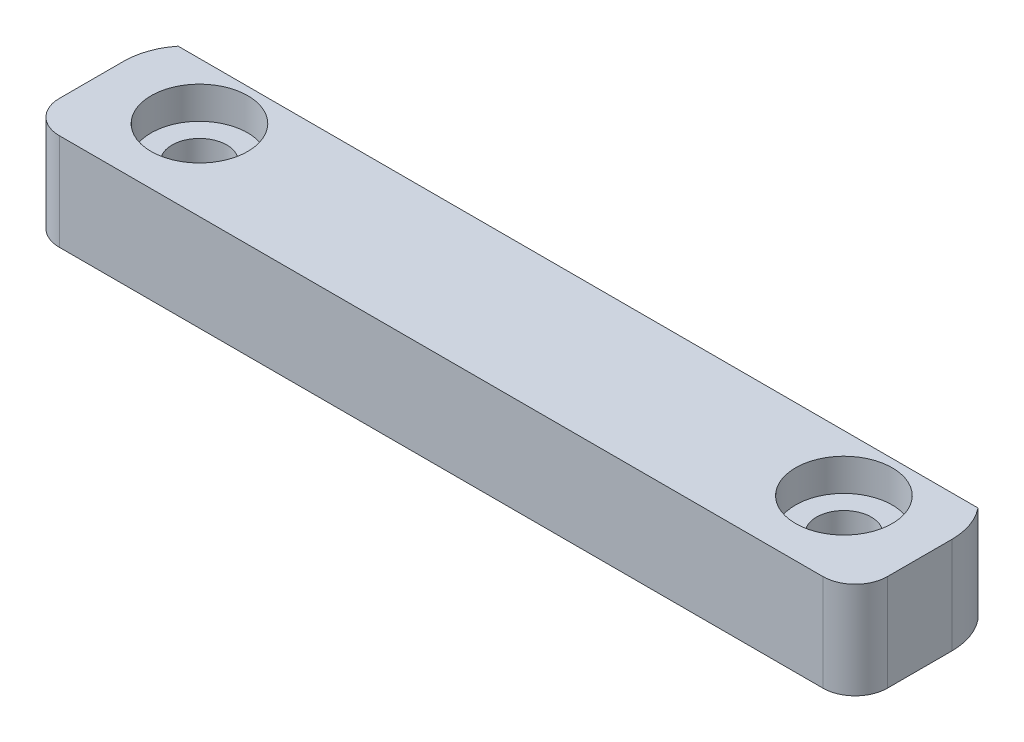
ISO-10303-21;
HEADER;
FILE_DESCRIPTION(('STEP AP214'),'2;1');
FILE_NAME('part.step','',(''),(''),'','','');
FILE_SCHEMA(('AUTOMOTIVE_DESIGN { 1 0 10303 214 1 1 1 1 }'));
ENDSEC;
DATA;
#1=APPLICATION_CONTEXT('core data for automotive mechanical design processes');
#2=APPLICATION_PROTOCOL_DEFINITION('international standard','automotive_design',2000,#1);
#3=PRODUCT_CONTEXT('',#1,'mechanical');
#4=PRODUCT('Part','Part','',(#3));
#5=PRODUCT_RELATED_PRODUCT_CATEGORY('part','',(#4));
#6=PRODUCT_DEFINITION_FORMATION('','',#4);
#7=PRODUCT_DEFINITION_CONTEXT('part definition',#1,'design');
#8=PRODUCT_DEFINITION('design','',#6,#7);
#9=PRODUCT_DEFINITION_SHAPE('','',#8);
#10=(LENGTH_UNIT() NAMED_UNIT(*) SI_UNIT(.MILLI.,.METRE.));
#11=(NAMED_UNIT(*) PLANE_ANGLE_UNIT() SI_UNIT($,.RADIAN.));
#12=(NAMED_UNIT(*) SI_UNIT($,.STERADIAN.) SOLID_ANGLE_UNIT());
#13=UNCERTAINTY_MEASURE_WITH_UNIT(LENGTH_MEASURE(1.E-05),#10,'distance_accuracy_value','');
#14=(GEOMETRIC_REPRESENTATION_CONTEXT(3) GLOBAL_UNCERTAINTY_ASSIGNED_CONTEXT((#13)) GLOBAL_UNIT_ASSIGNED_CONTEXT((#10,
#11,#12)) REPRESENTATION_CONTEXT('',''));
#15=CARTESIAN_POINT('',(0.,0.,0.));
#16=DIRECTION('',(0.,0.,1.));
#17=DIRECTION('',(1.,0.,0.));
#18=AXIS2_PLACEMENT_3D('',#15,#16,#17);
#19=CARTESIAN_POINT('',(20.,6.,0.));
#20=DIRECTION('',(0.,-1.,0.));
#21=DIRECTION('',(0.,0.,-1.));
#22=AXIS2_PLACEMENT_3D('',#19,#20,#21);
#23=CYLINDRICAL_SURFACE('',#22,1.7);
#24=CARTESIAN_POINT('',(20.,4.,0.));
#25=DIRECTION('',(0.,1.,0.));
#26=DIRECTION('',(0.,0.,1.));
#27=AXIS2_PLACEMENT_3D('',#24,#25,#26);
#28=CIRCLE('',#27,1.7);
#29=CARTESIAN_POINT('',(20.,4.,-1.7));
#30=VERTEX_POINT('',#29);
#31=EDGE_CURVE('E52',#30,#30,#28,.F.);
#32=ORIENTED_EDGE('',*,*,#31,.F.);
#33=DIRECTION('',(0.,1.,0.));
#34=VECTOR('',#33,1.);
#35=CARTESIAN_POINT('',(20.,0.,-1.7));
#36=LINE('',#35,#34);
#37=CARTESIAN_POINT('',(20.,0.,-1.7));
#38=VERTEX_POINT('',#37);
#39=EDGE_CURVE('E209',#38,#30,#36,.T.);
#40=ORIENTED_EDGE('',*,*,#39,.F.);
#41=CARTESIAN_POINT('',(20.,0.,0.));
#42=DIRECTION('',(0.,-1.,0.));
#43=DIRECTION('',(0.,0.,1.));
#44=AXIS2_PLACEMENT_3D('',#41,#42,#43);
#45=CIRCLE('',#44,1.7);
#46=CARTESIAN_POINT('',(20.,0.,1.7));
#47=VERTEX_POINT('',#46);
#48=EDGE_CURVE('E202',#38,#47,#45,.T.);
#49=ORIENTED_EDGE('',*,*,#48,.T.);
#50=CARTESIAN_POINT('',(20.,0.,0.));
#51=DIRECTION('',(0.,-1.,0.));
#52=DIRECTION('',(0.,0.,1.));
#53=AXIS2_PLACEMENT_3D('',#50,#51,#52);
#54=CIRCLE('',#53,1.7);
#55=EDGE_CURVE('E197',#47,#38,#54,.T.);
#56=ORIENTED_EDGE('',*,*,#55,.T.);
#57=ORIENTED_EDGE('',*,*,#39,.T.);
#58=EDGE_LOOP('',(#32,#40,#49,#56,#57));
#59=FACE_BOUND('',#58,.T.);
#60=ADVANCED_FACE('F48',(#59),#23,.F.);
#61=CARTESIAN_POINT('',(-20.,6.,0.));
#62=DIRECTION('',(0.,-1.,0.));
#63=DIRECTION('',(0.,0.,-1.));
#64=AXIS2_PLACEMENT_3D('',#61,#62,#63);
#65=CYLINDRICAL_SURFACE('',#64,1.7);
#66=CARTESIAN_POINT('',(-20.,4.,0.));
#67=DIRECTION('',(0.,1.,0.));
#68=DIRECTION('',(0.,0.,1.));
#69=AXIS2_PLACEMENT_3D('',#66,#67,#68);
#70=CIRCLE('',#69,1.7);
#71=CARTESIAN_POINT('',(-20.,4.,-1.7));
#72=VERTEX_POINT('',#71);
#73=EDGE_CURVE('E68',#72,#72,#70,.F.);
#74=ORIENTED_EDGE('',*,*,#73,.F.);
#75=DIRECTION('',(0.,1.,0.));
#76=VECTOR('',#75,1.);
#77=CARTESIAN_POINT('',(-20.,0.,-1.7));
#78=LINE('',#77,#76);
#79=CARTESIAN_POINT('',(-20.,0.,-1.7));
#80=VERTEX_POINT('',#79);
#81=EDGE_CURVE('E189',#80,#72,#78,.T.);
#82=ORIENTED_EDGE('',*,*,#81,.F.);
#83=CARTESIAN_POINT('',(-20.,0.,0.));
#84=DIRECTION('',(0.,1.,0.));
#85=DIRECTION('',(0.,0.,1.));
#86=AXIS2_PLACEMENT_3D('',#83,#84,#85);
#87=CIRCLE('',#86,1.7);
#88=CARTESIAN_POINT('',(-20.,0.,1.7));
#89=VERTEX_POINT('',#88);
#90=EDGE_CURVE('E201',#89,#80,#87,.T.);
#91=ORIENTED_EDGE('',*,*,#90,.F.);
#92=CARTESIAN_POINT('',(-20.,0.,0.));
#93=DIRECTION('',(0.,1.,0.));
#94=DIRECTION('',(0.,0.,1.));
#95=AXIS2_PLACEMENT_3D('',#92,#93,#94);
#96=CIRCLE('',#95,1.7);
#97=EDGE_CURVE('E218',#80,#89,#96,.T.);
#98=ORIENTED_EDGE('',*,*,#97,.F.);
#99=ORIENTED_EDGE('',*,*,#81,.T.);
#100=EDGE_LOOP('',(#74,#82,#91,#98,#99));
#101=FACE_BOUND('',#100,.T.);
#102=ADVANCED_FACE('F381',(#101),#65,.F.);
#103=CARTESIAN_POINT('',(-23.7,6.,3.));
#104=DIRECTION('',(0.,1.,0.));
#105=DIRECTION('',(0.,0.,1.));
#106=AXIS2_PLACEMENT_3D('',#103,#104,#105);
#107=CYLINDRICAL_SURFACE('',#106,2.);
#108=CARTESIAN_POINT('',(-23.7,6.,3.));
#109=DIRECTION('',(0.,1.,0.));
#110=DIRECTION('',(0.,0.,1.));
#111=AXIS2_PLACEMENT_3D('',#108,#109,#110);
#112=CIRCLE('',#111,2.);
#113=CARTESIAN_POINT('',(-25.7,6.,3.));
#114=VERTEX_POINT('',#113);
#115=CARTESIAN_POINT('',(-23.7,6.,5.));
#116=VERTEX_POINT('',#115);
#117=EDGE_CURVE('E179',#114,#116,#112,.T.);
#118=ORIENTED_EDGE('',*,*,#117,.F.);
#119=DIRECTION('',(0.,1.,0.));
#120=VECTOR('',#119,1.);
#121=CARTESIAN_POINT('',(-25.7,0.,3.));
#122=LINE('',#121,#120);
#123=CARTESIAN_POINT('',(-25.7,0.,3.));
#124=VERTEX_POINT('',#123);
#125=EDGE_CURVE('E206',#124,#114,#122,.T.);
#126=ORIENTED_EDGE('',*,*,#125,.F.);
#127=CARTESIAN_POINT('',(-23.7,0.,3.));
#128=DIRECTION('',(0.,-1.,0.));
#129=DIRECTION('',(0.,0.,1.));
#130=AXIS2_PLACEMENT_3D('',#127,#128,#129);
#131=CIRCLE('',#130,2.);
#132=CARTESIAN_POINT('',(-23.7,0.,5.));
#133=VERTEX_POINT('',#132);
#134=EDGE_CURVE('E236',#133,#124,#131,.T.);
#135=ORIENTED_EDGE('',*,*,#134,.F.);
#136=DIRECTION('',(0.,-1.,0.));
#137=VECTOR('',#136,1.);
#138=CARTESIAN_POINT('',(-23.7,6.,5.));
#139=LINE('',#138,#137);
#140=EDGE_CURVE('E207',#116,#133,#139,.T.);
#141=ORIENTED_EDGE('',*,*,#140,.F.);
#142=EDGE_LOOP('',(#118,#126,#135,#141));
#143=FACE_BOUND('',#142,.T.);
#144=ADVANCED_FACE('F367',(#143),#107,.T.);
#145=CARTESIAN_POINT('',(23.7,6.,3.));
#146=DIRECTION('',(0.,-1.,0.));
#147=DIRECTION('',(0.,0.,-1.));
#148=AXIS2_PLACEMENT_3D('',#145,#146,#147);
#149=CYLINDRICAL_SURFACE('',#148,2.);
#150=CARTESIAN_POINT('',(23.7,6.,3.));
#151=DIRECTION('',(0.,1.,0.));
#152=DIRECTION('',(0.,0.,1.));
#153=AXIS2_PLACEMENT_3D('',#150,#151,#152);
#154=CIRCLE('',#153,2.);
#155=CARTESIAN_POINT('',(23.7,6.,5.));
#156=VERTEX_POINT('',#155);
#157=CARTESIAN_POINT('',(25.7,6.,3.));
#158=VERTEX_POINT('',#157);
#159=EDGE_CURVE('E185',#156,#158,#154,.T.);
#160=ORIENTED_EDGE('',*,*,#159,.F.);
#161=DIRECTION('',(0.,1.,0.));
#162=VECTOR('',#161,1.);
#163=CARTESIAN_POINT('',(23.7,0.,5.));
#164=LINE('',#163,#162);
#165=CARTESIAN_POINT('',(23.7,0.,5.));
#166=VERTEX_POINT('',#165);
#167=EDGE_CURVE('E219',#166,#156,#164,.T.);
#168=ORIENTED_EDGE('',*,*,#167,.F.);
#169=CARTESIAN_POINT('',(23.7,0.,3.));
#170=DIRECTION('',(0.,-1.,0.));
#171=DIRECTION('',(0.,0.,1.));
#172=AXIS2_PLACEMENT_3D('',#169,#170,#171);
#173=CIRCLE('',#172,2.);
#174=CARTESIAN_POINT('',(25.7,0.,3.));
#175=VERTEX_POINT('',#174);
#176=EDGE_CURVE('E297',#175,#166,#173,.T.);
#177=ORIENTED_EDGE('',*,*,#176,.F.);
#178=DIRECTION('',(0.,-1.,0.));
#179=VECTOR('',#178,1.);
#180=CARTESIAN_POINT('',(25.7,6.,3.));
#181=LINE('',#180,#179);
#182=EDGE_CURVE('E226',#158,#175,#181,.T.);
#183=ORIENTED_EDGE('',*,*,#182,.F.);
#184=EDGE_LOOP('',(#160,#168,#177,#183));
#185=FACE_BOUND('',#184,.T.);
#186=ADVANCED_FACE('F360',(#185),#149,.T.);
#187=CARTESIAN_POINT('',(-21.7,6.,-1.));
#188=DIRECTION('',(0.,-1.,0.));
#189=DIRECTION('',(0.,0.,-1.));
#190=AXIS2_PLACEMENT_3D('',#187,#188,#189);
#191=CYLINDRICAL_SURFACE('',#190,4.);
#192=DIRECTION('',(0.,1.,0.));
#193=VECTOR('',#192,1.);
#194=CARTESIAN_POINT('',(-24.8224989991992,-4.,-3.5));
#195=LINE('',#194,#193);
#196=CARTESIAN_POINT('',(-24.8224989991992,0.,-3.5));
#197=VERTEX_POINT('',#196);
#198=CARTESIAN_POINT('',(-24.8224989991992,6.,-3.5));
#199=VERTEX_POINT('',#198);
#200=EDGE_CURVE('E154',#197,#199,#195,.T.);
#201=ORIENTED_EDGE('',*,*,#200,.F.);
#202=CARTESIAN_POINT('',(-21.7,0.,-1.));
#203=DIRECTION('',(0.,-1.,0.));
#204=DIRECTION('',(0.,0.,1.));
#205=AXIS2_PLACEMENT_3D('',#202,#203,#204);
#206=CIRCLE('',#205,4.);
#207=CARTESIAN_POINT('',(-25.7,0.,-1.));
#208=VERTEX_POINT('',#207);
#209=EDGE_CURVE('E235',#208,#197,#206,.T.);
#210=ORIENTED_EDGE('',*,*,#209,.F.);
#211=DIRECTION('',(0.,-1.,0.));
#212=VECTOR('',#211,1.);
#213=CARTESIAN_POINT('',(-25.7,6.,-1.));
#214=LINE('',#213,#212);
#215=CARTESIAN_POINT('',(-25.7,6.,-1.));
#216=VERTEX_POINT('',#215);
#217=EDGE_CURVE('E176',#216,#208,#214,.T.);
#218=ORIENTED_EDGE('',*,*,#217,.F.);
#219=CARTESIAN_POINT('',(-21.7,6.,-1.));
#220=DIRECTION('',(0.,1.,0.));
#221=DIRECTION('',(0.,0.,1.));
#222=AXIS2_PLACEMENT_3D('',#219,#220,#221);
#223=CIRCLE('',#222,4.);
#224=EDGE_CURVE('E170',#199,#216,#223,.T.);
#225=ORIENTED_EDGE('',*,*,#224,.F.);
#226=EDGE_LOOP('',(#201,#210,#218,#225));
#227=FACE_BOUND('',#226,.T.);
#228=ADVANCED_FACE('F50',(#227),#191,.T.);
#229=CARTESIAN_POINT('',(21.7,6.,-1.));
#230=DIRECTION('',(0.,1.,0.));
#231=DIRECTION('',(0.,0.,1.));
#232=AXIS2_PLACEMENT_3D('',#229,#230,#231);
#233=CYLINDRICAL_SURFACE('',#232,4.);
#234=DIRECTION('',(0.,1.,0.));
#235=VECTOR('',#234,1.);
#236=CARTESIAN_POINT('',(24.8224989991992,-4.,-3.5));
#237=LINE('',#236,#235);
#238=CARTESIAN_POINT('',(24.8224989991992,0.,-3.5));
#239=VERTEX_POINT('',#238);
#240=CARTESIAN_POINT('',(24.8224989991992,6.,-3.5));
#241=VERTEX_POINT('',#240);
#242=EDGE_CURVE('E164',#239,#241,#237,.T.);
#243=ORIENTED_EDGE('',*,*,#242,.T.);
#244=CARTESIAN_POINT('',(21.7,6.,-1.));
#245=DIRECTION('',(0.,1.,0.));
#246=DIRECTION('',(0.,0.,1.));
#247=AXIS2_PLACEMENT_3D('',#244,#245,#246);
#248=CIRCLE('',#247,4.);
#249=CARTESIAN_POINT('',(25.7,6.,-1.));
#250=VERTEX_POINT('',#249);
#251=EDGE_CURVE('E173',#250,#241,#248,.T.);
#252=ORIENTED_EDGE('',*,*,#251,.F.);
#253=DIRECTION('',(0.,1.,0.));
#254=VECTOR('',#253,1.);
#255=CARTESIAN_POINT('',(25.7,0.,-1.));
#256=LINE('',#255,#254);
#257=CARTESIAN_POINT('',(25.7,0.,-1.));
#258=VERTEX_POINT('',#257);
#259=EDGE_CURVE('E229',#258,#250,#256,.T.);
#260=ORIENTED_EDGE('',*,*,#259,.F.);
#261=CARTESIAN_POINT('',(21.7,0.,-1.));
#262=DIRECTION('',(0.,-1.,0.));
#263=DIRECTION('',(0.,0.,1.));
#264=AXIS2_PLACEMENT_3D('',#261,#262,#263);
#265=CIRCLE('',#264,4.);
#266=EDGE_CURVE('E239',#239,#258,#265,.T.);
#267=ORIENTED_EDGE('',*,*,#266,.F.);
#268=EDGE_LOOP('',(#243,#252,#260,#267));
#269=FACE_BOUND('',#268,.T.);
#270=ADVANCED_FACE('F352',(#269),#233,.T.);
#271=CARTESIAN_POINT('',(0.,3.8,0.));
#272=DIRECTION('',(0.,1.,0.));
#273=DIRECTION('',(1.,0.,0.));
#274=AXIS2_PLACEMENT_3D('',#271,#272,#273);
#275=PLANE('',#274);
#276=DIRECTION('',(0.,0.,-1.));
#277=VECTOR('',#276,1.);
#278=CARTESIAN_POINT('',(-2.65,3.8,2.2));
#279=LINE('',#278,#277);
#280=CARTESIAN_POINT('',(-2.65,3.8,2.2));
#281=VERTEX_POINT('',#280);
#282=CARTESIAN_POINT('',(-2.65,3.8,-3.5));
#283=VERTEX_POINT('',#282);
#284=EDGE_CURVE('E195',#281,#283,#279,.T.);
#285=ORIENTED_EDGE('',*,*,#284,.T.);
#286=DIRECTION('',(1.,0.,0.));
#287=VECTOR('',#286,1.);
#288=CARTESIAN_POINT('',(0.,3.8,-3.5));
#289=LINE('',#288,#287);
#290=CARTESIAN_POINT('',(2.65,3.8,-3.5));
#291=VERTEX_POINT('',#290);
#292=EDGE_CURVE('E270',#283,#291,#289,.T.);
#293=ORIENTED_EDGE('',*,*,#292,.T.);
#294=DIRECTION('',(0.,0.,-1.));
#295=VECTOR('',#294,1.);
#296=CARTESIAN_POINT('',(2.65,3.8,2.2));
#297=LINE('',#296,#295);
#298=CARTESIAN_POINT('',(2.65,3.8,2.2));
#299=VERTEX_POINT('',#298);
#300=EDGE_CURVE('E191',#299,#291,#297,.T.);
#301=ORIENTED_EDGE('',*,*,#300,.F.);
#302=DIRECTION('',(1.,0.,0.));
#303=VECTOR('',#302,1.);
#304=CARTESIAN_POINT('',(-2.65,3.8,2.2));
#305=LINE('',#304,#303);
#306=EDGE_CURVE('E298',#281,#299,#305,.T.);
#307=ORIENTED_EDGE('',*,*,#306,.F.);
#308=EDGE_LOOP('',(#285,#293,#301,#307));
#309=FACE_BOUND('',#308,.T.);
#310=ADVANCED_FACE('F347',(#309),#275,.F.);
#311=CARTESIAN_POINT('',(-2.65,3.8,0.));
#312=DIRECTION('',(-1.,0.,0.));
#313=DIRECTION('',(0.,0.,1.));
#314=AXIS2_PLACEMENT_3D('',#311,#312,#313);
#315=PLANE('',#314);
#316=DIRECTION('',(0.,0.,-1.));
#317=VECTOR('',#316,1.);
#318=CARTESIAN_POINT('',(-2.65,0.,2.2));
#319=LINE('',#318,#317);
#320=CARTESIAN_POINT('',(-2.65,0.,2.2));
#321=VERTEX_POINT('',#320);
#322=CARTESIAN_POINT('',(-2.65,0.,-3.5));
#323=VERTEX_POINT('',#322);
#324=EDGE_CURVE('E280',#321,#323,#319,.T.);
#325=ORIENTED_EDGE('',*,*,#324,.T.);
#326=DIRECTION('',(0.,1.,0.));
#327=VECTOR('',#326,1.);
#328=CARTESIAN_POINT('',(-2.65,3.8,-3.5));
#329=LINE('',#328,#327);
#330=EDGE_CURVE('E274',#323,#283,#329,.T.);
#331=ORIENTED_EDGE('',*,*,#330,.T.);
#332=ORIENTED_EDGE('',*,*,#284,.F.);
#333=DIRECTION('',(0.,-1.,0.));
#334=VECTOR('',#333,1.);
#335=CARTESIAN_POINT('',(-2.65,3.8,2.2));
#336=LINE('',#335,#334);
#337=EDGE_CURVE('E183',#281,#321,#336,.T.);
#338=ORIENTED_EDGE('',*,*,#337,.T.);
#339=EDGE_LOOP('',(#325,#331,#332,#338));
#340=FACE_BOUND('',#339,.T.);
#341=ADVANCED_FACE('F345',(#340),#315,.F.);
#342=CARTESIAN_POINT('',(2.65,3.8,0.));
#343=DIRECTION('',(-1.,0.,0.));
#344=DIRECTION('',(0.,0.,1.));
#345=AXIS2_PLACEMENT_3D('',#342,#343,#344);
#346=PLANE('',#345);
#347=DIRECTION('',(0.,1.,0.));
#348=VECTOR('',#347,1.);
#349=CARTESIAN_POINT('',(2.65,3.8,-3.5));
#350=LINE('',#349,#348);
#351=CARTESIAN_POINT('',(2.65,0.,-3.5));
#352=VERTEX_POINT('',#351);
#353=EDGE_CURVE('E266',#352,#291,#350,.T.);
#354=ORIENTED_EDGE('',*,*,#353,.F.);
#355=DIRECTION('',(0.,0.,-1.));
#356=VECTOR('',#355,1.);
#357=CARTESIAN_POINT('',(2.65,0.,2.2));
#358=LINE('',#357,#356);
#359=CARTESIAN_POINT('',(2.65,0.,2.2));
#360=VERTEX_POINT('',#359);
#361=EDGE_CURVE('E241',#360,#352,#358,.T.);
#362=ORIENTED_EDGE('',*,*,#361,.F.);
#363=DIRECTION('',(0.,-1.,0.));
#364=VECTOR('',#363,1.);
#365=CARTESIAN_POINT('',(2.65,3.8,2.2));
#366=LINE('',#365,#364);
#367=EDGE_CURVE('E196',#299,#360,#366,.T.);
#368=ORIENTED_EDGE('',*,*,#367,.F.);
#369=ORIENTED_EDGE('',*,*,#300,.T.);
#370=EDGE_LOOP('',(#354,#362,#368,#369));
#371=FACE_BOUND('',#370,.T.);
#372=ADVANCED_FACE('F340',(#371),#346,.T.);
#373=CARTESIAN_POINT('',(0.,3.8,2.2));
#374=DIRECTION('',(0.,0.,-1.));
#375=DIRECTION('',(0.,-1.,0.));
#376=AXIS2_PLACEMENT_3D('',#373,#374,#375);
#377=PLANE('',#376);
#378=DIRECTION('',(1.,0.,0.));
#379=VECTOR('',#378,1.);
#380=CARTESIAN_POINT('',(-2.65,0.,2.2));
#381=LINE('',#380,#379);
#382=EDGE_CURVE('E293',#321,#360,#381,.T.);
#383=ORIENTED_EDGE('',*,*,#382,.F.);
#384=ORIENTED_EDGE('',*,*,#337,.F.);
#385=ORIENTED_EDGE('',*,*,#306,.T.);
#386=ORIENTED_EDGE('',*,*,#367,.T.);
#387=EDGE_LOOP('',(#383,#384,#385,#386));
#388=FACE_BOUND('',#387,.T.);
#389=ADVANCED_FACE('F334',(#388),#377,.T.);
#390=CARTESIAN_POINT('',(0.,6.,0.));
#391=DIRECTION('',(0.,1.,0.));
#392=DIRECTION('',(1.,0.,0.));
#393=AXIS2_PLACEMENT_3D('',#390,#391,#392);
#394=PLANE('',#393);
#395=CARTESIAN_POINT('',(-20.,6.,0.));
#396=DIRECTION('',(0.,1.,0.));
#397=DIRECTION('',(0.,0.,1.));
#398=AXIS2_PLACEMENT_3D('',#395,#396,#397);
#399=CIRCLE('',#398,3.);
#400=CARTESIAN_POINT('',(-20.,6.,3.));
#401=VERTEX_POINT('',#400);
#402=EDGE_CURVE('E249',#401,#401,#399,.T.);
#403=ORIENTED_EDGE('',*,*,#402,.F.);
#404=EDGE_LOOP('',(#403));
#405=FACE_BOUND('',#404,.T.);
#406=CARTESIAN_POINT('',(20.,6.,0.));
#407=DIRECTION('',(0.,1.,0.));
#408=DIRECTION('',(0.,0.,1.));
#409=AXIS2_PLACEMENT_3D('',#406,#407,#408);
#410=CIRCLE('',#409,3.);
#411=CARTESIAN_POINT('',(20.,6.,3.));
#412=VERTEX_POINT('',#411);
#413=EDGE_CURVE('E261',#412,#412,#410,.T.);
#414=ORIENTED_EDGE('',*,*,#413,.F.);
#415=EDGE_LOOP('',(#414));
#416=FACE_BOUND('',#415,.T.);
#417=DIRECTION('',(1.,0.,0.));
#418=VECTOR('',#417,1.);
#419=CARTESIAN_POINT('',(0.,6.,-3.5));
#420=LINE('',#419,#418);
#421=EDGE_CURVE('E157',#199,#241,#420,.T.);
#422=ORIENTED_EDGE('',*,*,#421,.F.);
#423=ORIENTED_EDGE('',*,*,#224,.T.);
#424=DIRECTION('',(0.,0.,-1.));
#425=VECTOR('',#424,1.);
#426=CARTESIAN_POINT('',(-25.7,6.,3.));
#427=LINE('',#426,#425);
#428=EDGE_CURVE('E203',#114,#216,#427,.T.);
#429=ORIENTED_EDGE('',*,*,#428,.F.);
#430=ORIENTED_EDGE('',*,*,#117,.T.);
#431=DIRECTION('',(1.,0.,0.));
#432=VECTOR('',#431,1.);
#433=CARTESIAN_POINT('',(-23.7,6.,5.));
#434=LINE('',#433,#432);
#435=EDGE_CURVE('E210',#116,#156,#434,.T.);
#436=ORIENTED_EDGE('',*,*,#435,.T.);
#437=ORIENTED_EDGE('',*,*,#159,.T.);
#438=DIRECTION('',(0.,0.,-1.));
#439=VECTOR('',#438,1.);
#440=CARTESIAN_POINT('',(25.7,6.,3.));
#441=LINE('',#440,#439);
#442=EDGE_CURVE('E230',#158,#250,#441,.T.);
#443=ORIENTED_EDGE('',*,*,#442,.T.);
#444=ORIENTED_EDGE('',*,*,#251,.T.);
#445=EDGE_LOOP('',(#422,#423,#429,#430,#436,#437,#443,#444));
#446=FACE_BOUND('',#445,.T.);
#447=ADVANCED_FACE('F168',(#405,#416,#446),#394,.T.);
#448=CARTESIAN_POINT('',(0.,6.,5.));
#449=DIRECTION('',(0.,0.,-1.));
#450=DIRECTION('',(0.,-1.,0.));
#451=AXIS2_PLACEMENT_3D('',#448,#449,#450);
#452=PLANE('',#451);
#453=DIRECTION('',(1.,0.,0.));
#454=VECTOR('',#453,1.);
#455=CARTESIAN_POINT('',(-23.7,0.,5.));
#456=LINE('',#455,#454);
#457=EDGE_CURVE('E316',#133,#166,#456,.T.);
#458=ORIENTED_EDGE('',*,*,#457,.T.);
#459=ORIENTED_EDGE('',*,*,#167,.T.);
#460=ORIENTED_EDGE('',*,*,#435,.F.);
#461=ORIENTED_EDGE('',*,*,#140,.T.);
#462=EDGE_LOOP('',(#458,#459,#460,#461));
#463=FACE_BOUND('',#462,.T.);
#464=ADVANCED_FACE('F363',(#463),#452,.F.);
#465=CARTESIAN_POINT('',(-25.7,6.,0.));
#466=DIRECTION('',(-1.,0.,0.));
#467=DIRECTION('',(0.,0.,1.));
#468=AXIS2_PLACEMENT_3D('',#465,#466,#467);
#469=PLANE('',#468);
#470=DIRECTION('',(0.,0.,-1.));
#471=VECTOR('',#470,1.);
#472=CARTESIAN_POINT('',(-25.7,0.,3.));
#473=LINE('',#472,#471);
#474=EDGE_CURVE('E231',#124,#208,#473,.T.);
#475=ORIENTED_EDGE('',*,*,#474,.F.);
#476=ORIENTED_EDGE('',*,*,#125,.T.);
#477=ORIENTED_EDGE('',*,*,#428,.T.);
#478=ORIENTED_EDGE('',*,*,#217,.T.);
#479=EDGE_LOOP('',(#475,#476,#477,#478));
#480=FACE_BOUND('',#479,.T.);
#481=ADVANCED_FACE('F370',(#480),#469,.T.);
#482=CARTESIAN_POINT('',(25.7,6.,0.));
#483=DIRECTION('',(-1.,0.,0.));
#484=DIRECTION('',(0.,0.,1.));
#485=AXIS2_PLACEMENT_3D('',#482,#483,#484);
#486=PLANE('',#485);
#487=ORIENTED_EDGE('',*,*,#442,.F.);
#488=ORIENTED_EDGE('',*,*,#182,.T.);
#489=DIRECTION('',(0.,0.,-1.));
#490=VECTOR('',#489,1.);
#491=CARTESIAN_POINT('',(25.7,0.,3.));
#492=LINE('',#491,#490);
#493=EDGE_CURVE('E288',#175,#258,#492,.T.);
#494=ORIENTED_EDGE('',*,*,#493,.T.);
#495=ORIENTED_EDGE('',*,*,#259,.T.);
#496=EDGE_LOOP('',(#487,#488,#494,#495));
#497=FACE_BOUND('',#496,.T.);
#498=ADVANCED_FACE('F355',(#497),#486,.F.);
#499=CARTESIAN_POINT('',(0.,0.,0.));
#500=DIRECTION('',(0.,1.,0.));
#501=DIRECTION('',(1.,0.,0.));
#502=AXIS2_PLACEMENT_3D('',#499,#500,#501);
#503=PLANE('',#502);
#504=ORIENTED_EDGE('',*,*,#209,.T.);
#505=DIRECTION('',(1.,0.,0.));
#506=VECTOR('',#505,1.);
#507=CARTESIAN_POINT('',(0.,0.,-3.5));
#508=LINE('',#507,#506);
#509=EDGE_CURVE('E11',#197,#323,#508,.T.);
#510=ORIENTED_EDGE('',*,*,#509,.T.);
#511=ORIENTED_EDGE('',*,*,#324,.F.);
#512=ORIENTED_EDGE('',*,*,#382,.T.);
#513=ORIENTED_EDGE('',*,*,#361,.T.);
#514=EDGE_CURVE('E58',#352,#239,#508,.T.);
#515=ORIENTED_EDGE('',*,*,#514,.T.);
#516=ORIENTED_EDGE('',*,*,#266,.T.);
#517=ORIENTED_EDGE('',*,*,#493,.F.);
#518=ORIENTED_EDGE('',*,*,#176,.T.);
#519=ORIENTED_EDGE('',*,*,#457,.F.);
#520=ORIENTED_EDGE('',*,*,#134,.T.);
#521=ORIENTED_EDGE('',*,*,#474,.T.);
#522=EDGE_LOOP('',(#504,#510,#511,#512,#513,#515,#516,#517,#518,#519,#520,#521));
#523=FACE_BOUND('',#522,.T.);
#524=ORIENTED_EDGE('',*,*,#90,.T.);
#525=ORIENTED_EDGE('',*,*,#97,.T.);
#526=EDGE_LOOP('',(#524,#525));
#527=FACE_BOUND('',#526,.T.);
#528=ORIENTED_EDGE('',*,*,#48,.F.);
#529=ORIENTED_EDGE('',*,*,#55,.F.);
#530=EDGE_LOOP('',(#528,#529));
#531=FACE_BOUND('',#530,.T.);
#532=ADVANCED_FACE('F342',(#523,#527,#531),#503,.F.);
#533=CARTESIAN_POINT('',(0.,-4.,-3.5));
#534=DIRECTION('',(0.,0.,1.));
#535=DIRECTION('',(1.,0.,0.));
#536=AXIS2_PLACEMENT_3D('',#533,#534,#535);
#537=PLANE('',#536);
#538=ORIENTED_EDGE('',*,*,#200,.T.);
#539=ORIENTED_EDGE('',*,*,#421,.T.);
#540=ORIENTED_EDGE('',*,*,#242,.F.);
#541=ORIENTED_EDGE('',*,*,#514,.F.);
#542=ORIENTED_EDGE('',*,*,#353,.T.);
#543=ORIENTED_EDGE('',*,*,#292,.F.);
#544=ORIENTED_EDGE('',*,*,#330,.F.);
#545=ORIENTED_EDGE('',*,*,#509,.F.);
#546=EDGE_LOOP('',(#538,#539,#540,#541,#542,#543,#544,#545));
#547=FACE_BOUND('',#546,.T.);
#548=ADVANCED_FACE('F156',(#547),#537,.F.);
#549=CARTESIAN_POINT('',(-20.,4.,0.));
#550=DIRECTION('',(0.,1.,0.));
#551=DIRECTION('',(0.,0.,1.));
#552=AXIS2_PLACEMENT_3D('',#549,#550,#551);
#553=PLANE('',#552);
#554=CARTESIAN_POINT('',(-20.,4.,0.));
#555=DIRECTION('',(0.,1.,0.));
#556=DIRECTION('',(0.,0.,1.));
#557=AXIS2_PLACEMENT_3D('',#554,#555,#556);
#558=CIRCLE('',#557,3.);
#559=CARTESIAN_POINT('',(-20.,4.,3.));
#560=VERTEX_POINT('',#559);
#561=EDGE_CURVE('E245',#560,#560,#558,.T.);
#562=ORIENTED_EDGE('',*,*,#561,.T.);
#563=EDGE_LOOP('',(#562));
#564=FACE_BOUND('',#563,.T.);
#565=ORIENTED_EDGE('',*,*,#73,.T.);
#566=EDGE_LOOP('',(#565));
#567=FACE_BOUND('',#566,.T.);
#568=ADVANCED_FACE('F406',(#564,#567),#553,.T.);
#569=CARTESIAN_POINT('',(-20.,4.,0.));
#570=DIRECTION('',(0.,1.,0.));
#571=DIRECTION('',(0.,0.,1.));
#572=AXIS2_PLACEMENT_3D('',#569,#570,#571);
#573=CYLINDRICAL_SURFACE('',#572,3.);
#574=ORIENTED_EDGE('',*,*,#561,.F.);
#575=EDGE_LOOP('',(#574));
#576=FACE_BOUND('',#575,.T.);
#577=ORIENTED_EDGE('',*,*,#402,.T.);
#578=EDGE_LOOP('',(#577));
#579=FACE_BOUND('',#578,.T.);
#580=ADVANCED_FACE('F410',(#576,#579),#573,.F.);
#581=CARTESIAN_POINT('',(20.,4.,0.));
#582=DIRECTION('',(0.,1.,0.));
#583=DIRECTION('',(0.,0.,1.));
#584=AXIS2_PLACEMENT_3D('',#581,#582,#583);
#585=PLANE('',#584);
#586=CARTESIAN_POINT('',(20.,4.,0.));
#587=DIRECTION('',(0.,1.,0.));
#588=DIRECTION('',(0.,0.,1.));
#589=AXIS2_PLACEMENT_3D('',#586,#587,#588);
#590=CIRCLE('',#589,3.);
#591=CARTESIAN_POINT('',(20.,4.,3.));
#592=VERTEX_POINT('',#591);
#593=EDGE_CURVE('E255',#592,#592,#590,.T.);
#594=ORIENTED_EDGE('',*,*,#593,.T.);
#595=EDGE_LOOP('',(#594));
#596=FACE_BOUND('',#595,.T.);
#597=ORIENTED_EDGE('',*,*,#31,.T.);
#598=EDGE_LOOP('',(#597));
#599=FACE_BOUND('',#598,.T.);
#600=ADVANCED_FACE('F416',(#596,#599),#585,.T.);
#601=CARTESIAN_POINT('',(20.,4.,0.));
#602=DIRECTION('',(0.,1.,0.));
#603=DIRECTION('',(0.,0.,1.));
#604=AXIS2_PLACEMENT_3D('',#601,#602,#603);
#605=CYLINDRICAL_SURFACE('',#604,3.);
#606=ORIENTED_EDGE('',*,*,#593,.F.);
#607=EDGE_LOOP('',(#606));
#608=FACE_BOUND('',#607,.T.);
#609=ORIENTED_EDGE('',*,*,#413,.T.);
#610=EDGE_LOOP('',(#609));
#611=FACE_BOUND('',#610,.T.);
#612=ADVANCED_FACE('F421',(#608,#611),#605,.F.);
#613=CLOSED_SHELL('',(#60,#102,#144,#186,#228,#270,#310,#341,#372,#389,#447,#464,#481,#498,#532,
#548,#568,#580,#600,#612));
#614=MANIFOLD_SOLID_BREP('B2',#613);
#615=ADVANCED_BREP_SHAPE_REPRESENTATION('',(#18,#614),#14);
#616=SHAPE_DEFINITION_REPRESENTATION(#9,#615);
ENDSEC;
END-ISO-10303-21;
